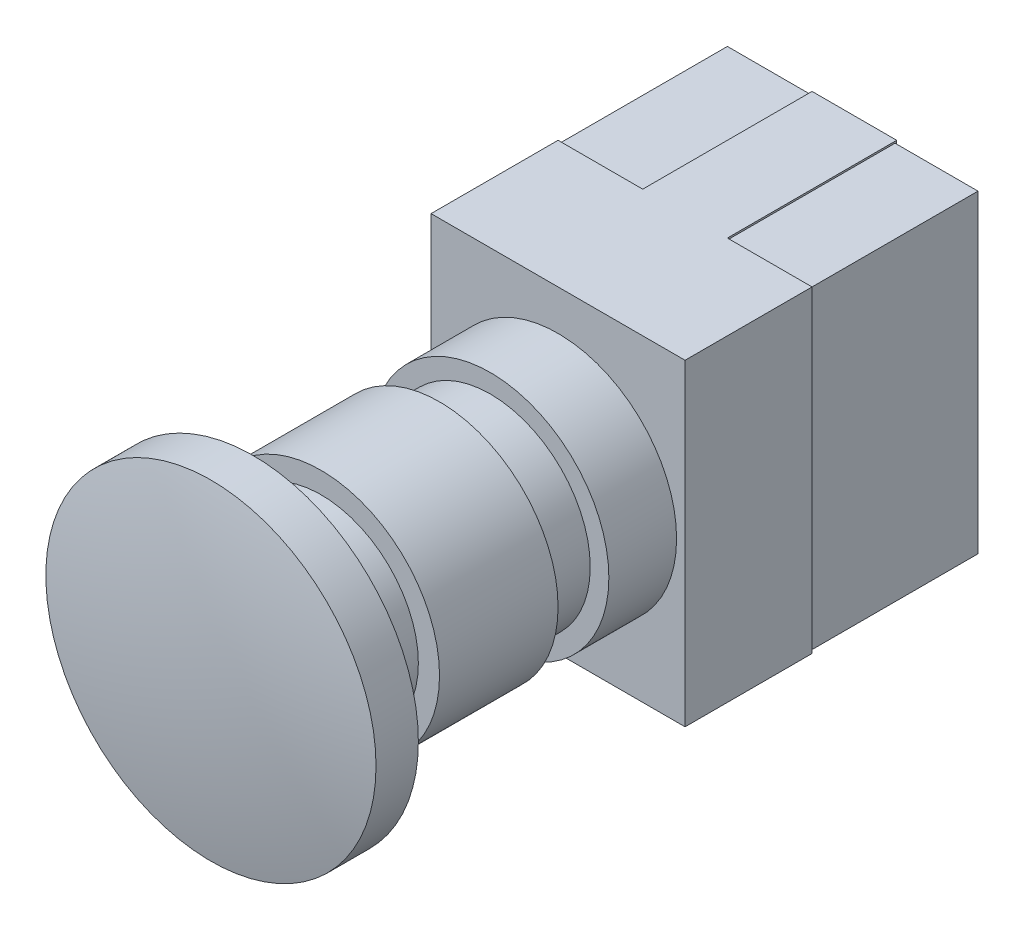
ISO-10303-21;
HEADER;
FILE_DESCRIPTION(('STEP AP214'),'2;1');
FILE_NAME('part.step','',(''),(''),'','','');
FILE_SCHEMA(('AUTOMOTIVE_DESIGN { 1 0 10303 214 1 1 1 1 }'));
ENDSEC;
DATA;
#1=APPLICATION_CONTEXT('core data for automotive mechanical design processes');
#2=APPLICATION_PROTOCOL_DEFINITION('international standard','automotive_design',2000,#1);
#3=PRODUCT_CONTEXT('',#1,'mechanical');
#4=PRODUCT('Part','Part','',(#3));
#5=PRODUCT_RELATED_PRODUCT_CATEGORY('part','',(#4));
#6=PRODUCT_DEFINITION_FORMATION('','',#4);
#7=PRODUCT_DEFINITION_CONTEXT('part definition',#1,'design');
#8=PRODUCT_DEFINITION('design','',#6,#7);
#9=PRODUCT_DEFINITION_SHAPE('','',#8);
#10=(LENGTH_UNIT() NAMED_UNIT(*) SI_UNIT(.MILLI.,.METRE.));
#11=(NAMED_UNIT(*) PLANE_ANGLE_UNIT() SI_UNIT($,.RADIAN.));
#12=(NAMED_UNIT(*) SI_UNIT($,.STERADIAN.) SOLID_ANGLE_UNIT());
#13=UNCERTAINTY_MEASURE_WITH_UNIT(LENGTH_MEASURE(1.E-05),#10,'distance_accuracy_value','');
#14=(GEOMETRIC_REPRESENTATION_CONTEXT(3) GLOBAL_UNCERTAINTY_ASSIGNED_CONTEXT((#13)) GLOBAL_UNIT_ASSIGNED_CONTEXT((#10,
#11,#12)) REPRESENTATION_CONTEXT('',''));
#15=CARTESIAN_POINT('',(0.,0.,0.));
#16=DIRECTION('',(0.,0.,1.));
#17=DIRECTION('',(1.,0.,0.));
#18=AXIS2_PLACEMENT_3D('',#15,#16,#17);
#19=CARTESIAN_POINT('',(5.,18.55,20.));
#20=DIRECTION('',(0.,-1.,0.));
#21=DIRECTION('',(0.,0.,-1.));
#22=AXIS2_PLACEMENT_3D('',#19,#20,#21);
#23=PLANE('',#22);
#24=DIRECTION('',(1.,0.,0.));
#25=VECTOR('',#24,1.);
#26=CARTESIAN_POINT('',(14.8,18.55,0.2));
#27=LINE('',#26,#25);
#28=CARTESIAN_POINT('',(5.,18.55,0.2));
#29=VERTEX_POINT('',#28);
#30=CARTESIAN_POINT('',(14.8,18.55,0.2));
#31=VERTEX_POINT('',#30);
#32=EDGE_CURVE('E163',#29,#31,#27,.T.);
#33=ORIENTED_EDGE('',*,*,#32,.F.);
#34=DIRECTION('',(0.,0.,-1.));
#35=VECTOR('',#34,1.);
#36=CARTESIAN_POINT('',(5.,18.55,20.));
#37=LINE('',#36,#35);
#38=CARTESIAN_POINT('',(5.,18.55,20.));
#39=VERTEX_POINT('',#38);
#40=EDGE_CURVE('E193',#39,#29,#37,.T.);
#41=ORIENTED_EDGE('',*,*,#40,.F.);
#42=DIRECTION('',(-1.,0.,0.));
#43=VECTOR('',#42,1.);
#44=CARTESIAN_POINT('',(5.,18.55,20.));
#45=LINE('',#44,#43);
#46=CARTESIAN_POINT('',(14.8,18.55,20.));
#47=VERTEX_POINT('',#46);
#48=EDGE_CURVE('E325',#47,#39,#45,.T.);
#49=ORIENTED_EDGE('',*,*,#48,.F.);
#50=DIRECTION('',(0.,0.,-1.));
#51=VECTOR('',#50,1.);
#52=CARTESIAN_POINT('',(14.8,18.55,20.));
#53=LINE('',#52,#51);
#54=EDGE_CURVE('E180',#47,#31,#53,.T.);
#55=ORIENTED_EDGE('',*,*,#54,.T.);
#56=EDGE_LOOP('',(#33,#41,#49,#55));
#57=FACE_BOUND('',#56,.T.);
#58=ADVANCED_FACE('F41',(#57),#23,.F.);
#59=CARTESIAN_POINT('',(14.8,-18.55,20.));
#60=DIRECTION('',(-1.,0.,0.));
#61=DIRECTION('',(0.,0.,1.));
#62=AXIS2_PLACEMENT_3D('',#59,#60,#61);
#63=PLANE('',#62);
#64=DIRECTION('',(0.,-1.,0.));
#65=VECTOR('',#64,1.);
#66=CARTESIAN_POINT('',(14.8,18.55,0.2));
#67=LINE('',#66,#65);
#68=CARTESIAN_POINT('',(14.8,-18.55,0.2));
#69=VERTEX_POINT('',#68);
#70=EDGE_CURVE('E157',#31,#69,#67,.T.);
#71=ORIENTED_EDGE('',*,*,#70,.F.);
#72=ORIENTED_EDGE('',*,*,#54,.F.);
#73=DIRECTION('',(0.,1.,0.));
#74=VECTOR('',#73,1.);
#75=CARTESIAN_POINT('',(14.8,-18.55,20.));
#76=LINE('',#75,#74);
#77=CARTESIAN_POINT('',(14.8,-18.55,20.));
#78=VERTEX_POINT('',#77);
#79=EDGE_CURVE('E179',#78,#47,#76,.T.);
#80=ORIENTED_EDGE('',*,*,#79,.F.);
#81=DIRECTION('',(0.,0.,-1.));
#82=VECTOR('',#81,1.);
#83=CARTESIAN_POINT('',(14.8,-18.55,20.));
#84=LINE('',#83,#82);
#85=EDGE_CURVE('E171',#78,#69,#84,.T.);
#86=ORIENTED_EDGE('',*,*,#85,.T.);
#87=EDGE_LOOP('',(#71,#72,#80,#86));
#88=FACE_BOUND('',#87,.T.);
#89=ADVANCED_FACE('F177',(#88),#63,.F.);
#90=CARTESIAN_POINT('',(5.,-18.55,20.));
#91=DIRECTION('',(0.,1.,0.));
#92=DIRECTION('',(0.,0.,1.));
#93=AXIS2_PLACEMENT_3D('',#90,#91,#92);
#94=PLANE('',#93);
#95=DIRECTION('',(-1.,0.,0.));
#96=VECTOR('',#95,1.);
#97=CARTESIAN_POINT('',(14.8,-18.55,0.2));
#98=LINE('',#97,#96);
#99=CARTESIAN_POINT('',(5.,-18.55,0.2));
#100=VERTEX_POINT('',#99);
#101=EDGE_CURVE('E160',#69,#100,#98,.T.);
#102=ORIENTED_EDGE('',*,*,#101,.F.);
#103=ORIENTED_EDGE('',*,*,#85,.F.);
#104=DIRECTION('',(1.,0.,0.));
#105=VECTOR('',#104,1.);
#106=CARTESIAN_POINT('',(5.,-18.55,20.));
#107=LINE('',#106,#105);
#108=CARTESIAN_POINT('',(5.,-18.55,20.));
#109=VERTEX_POINT('',#108);
#110=EDGE_CURVE('E323',#109,#78,#107,.T.);
#111=ORIENTED_EDGE('',*,*,#110,.F.);
#112=DIRECTION('',(0.,0.,-1.));
#113=VECTOR('',#112,1.);
#114=CARTESIAN_POINT('',(5.,-18.55,20.));
#115=LINE('',#114,#113);
#116=EDGE_CURVE('E173',#109,#100,#115,.T.);
#117=ORIENTED_EDGE('',*,*,#116,.T.);
#118=EDGE_LOOP('',(#102,#103,#111,#117));
#119=FACE_BOUND('',#118,.T.);
#120=ADVANCED_FACE('F169',(#119),#94,.F.);
#121=CARTESIAN_POINT('',(-15.,18.75,35.));
#122=DIRECTION('',(1.,0.,0.));
#123=DIRECTION('',(0.,1.,0.));
#124=AXIS2_PLACEMENT_3D('',#121,#122,#123);
#125=PLANE('',#124);
#126=DIRECTION('',(0.,1.,0.));
#127=VECTOR('',#126,1.);
#128=CARTESIAN_POINT('',(-15.,-18.75,20.));
#129=LINE('',#128,#127);
#130=CARTESIAN_POINT('',(-15.,-18.75,20.));
#131=VERTEX_POINT('',#130);
#132=CARTESIAN_POINT('',(-15.,18.75,20.));
#133=VERTEX_POINT('',#132);
#134=EDGE_CURVE('E227',#131,#133,#129,.T.);
#135=ORIENTED_EDGE('',*,*,#134,.F.);
#136=DIRECTION('',(0.,0.,-1.));
#137=VECTOR('',#136,1.);
#138=CARTESIAN_POINT('',(-15.,-18.75,35.));
#139=LINE('',#138,#137);
#140=CARTESIAN_POINT('',(-15.,-18.75,35.));
#141=VERTEX_POINT('',#140);
#142=EDGE_CURVE('E292',#141,#131,#139,.T.);
#143=ORIENTED_EDGE('',*,*,#142,.F.);
#144=DIRECTION('',(0.,-1.,0.));
#145=VECTOR('',#144,1.);
#146=CARTESIAN_POINT('',(-15.,18.75,35.));
#147=LINE('',#146,#145);
#148=CARTESIAN_POINT('',(-15.,18.75,35.));
#149=VERTEX_POINT('',#148);
#150=EDGE_CURVE('E282',#149,#141,#147,.T.);
#151=ORIENTED_EDGE('',*,*,#150,.F.);
#152=DIRECTION('',(0.,0.,-1.));
#153=VECTOR('',#152,1.);
#154=CARTESIAN_POINT('',(-15.,18.75,35.));
#155=LINE('',#154,#153);
#156=EDGE_CURVE('E294',#149,#133,#155,.T.);
#157=ORIENTED_EDGE('',*,*,#156,.T.);
#158=EDGE_LOOP('',(#135,#143,#151,#157));
#159=FACE_BOUND('',#158,.T.);
#160=ADVANCED_FACE('F450',(#159),#125,.F.);
#161=CARTESIAN_POINT('',(15.,18.75,35.));
#162=DIRECTION('',(-1.,0.,0.));
#163=DIRECTION('',(0.,-1.,0.));
#164=AXIS2_PLACEMENT_3D('',#161,#162,#163);
#165=PLANE('',#164);
#166=DIRECTION('',(0.,0.,-1.));
#167=VECTOR('',#166,1.);
#168=CARTESIAN_POINT('',(15.,-18.75,35.));
#169=LINE('',#168,#167);
#170=CARTESIAN_POINT('',(15.,-18.75,35.));
#171=VERTEX_POINT('',#170);
#172=CARTESIAN_POINT('',(15.,-18.75,20.));
#173=VERTEX_POINT('',#172);
#174=EDGE_CURVE('E285',#171,#173,#169,.T.);
#175=ORIENTED_EDGE('',*,*,#174,.T.);
#176=DIRECTION('',(0.,-1.,0.));
#177=VECTOR('',#176,1.);
#178=CARTESIAN_POINT('',(15.,-18.75,20.));
#179=LINE('',#178,#177);
#180=CARTESIAN_POINT('',(15.,18.75,20.));
#181=VERTEX_POINT('',#180);
#182=EDGE_CURVE('E309',#181,#173,#179,.T.);
#183=ORIENTED_EDGE('',*,*,#182,.F.);
#184=DIRECTION('',(0.,0.,-1.));
#185=VECTOR('',#184,1.);
#186=CARTESIAN_POINT('',(15.,18.75,35.));
#187=LINE('',#186,#185);
#188=CARTESIAN_POINT('',(15.,18.75,35.));
#189=VERTEX_POINT('',#188);
#190=EDGE_CURVE('E45',#189,#181,#187,.T.);
#191=ORIENTED_EDGE('',*,*,#190,.F.);
#192=DIRECTION('',(0.,1.,0.));
#193=VECTOR('',#192,1.);
#194=CARTESIAN_POINT('',(15.,18.75,35.));
#195=LINE('',#194,#193);
#196=EDGE_CURVE('E277',#171,#189,#195,.T.);
#197=ORIENTED_EDGE('',*,*,#196,.F.);
#198=EDGE_LOOP('',(#175,#183,#191,#197));
#199=FACE_BOUND('',#198,.T.);
#200=ADVANCED_FACE('F43',(#199),#165,.F.);
#201=CARTESIAN_POINT('',(-15.,18.75,35.));
#202=DIRECTION('',(0.,-1.,0.));
#203=DIRECTION('',(1.,0.,0.));
#204=AXIS2_PLACEMENT_3D('',#201,#202,#203);
#205=PLANE('',#204);
#206=DIRECTION('',(1.,0.,0.));
#207=VECTOR('',#206,1.);
#208=CARTESIAN_POINT('',(5.,18.75,20.));
#209=LINE('',#208,#207);
#210=CARTESIAN_POINT('',(5.,18.75,20.));
#211=VERTEX_POINT('',#210);
#212=EDGE_CURVE('E305',#211,#181,#209,.T.);
#213=ORIENTED_EDGE('',*,*,#212,.F.);
#214=DIRECTION('',(0.,0.,-1.));
#215=VECTOR('',#214,1.);
#216=CARTESIAN_POINT('',(5.,18.75,20.));
#217=LINE('',#216,#215);
#218=CARTESIAN_POINT('',(5.,18.75,0.));
#219=VERTEX_POINT('',#218);
#220=EDGE_CURVE('E190',#211,#219,#217,.T.);
#221=ORIENTED_EDGE('',*,*,#220,.T.);
#222=DIRECTION('',(-1.,0.,0.));
#223=VECTOR('',#222,1.);
#224=CARTESIAN_POINT('',(-15.,18.75,0.));
#225=LINE('',#224,#223);
#226=CARTESIAN_POINT('',(-5.,18.75,0.));
#227=VERTEX_POINT('',#226);
#228=EDGE_CURVE('E274',#219,#227,#225,.T.);
#229=ORIENTED_EDGE('',*,*,#228,.T.);
#230=DIRECTION('',(0.,0.,-1.));
#231=VECTOR('',#230,1.);
#232=CARTESIAN_POINT('',(-5.,18.75,20.));
#233=LINE('',#232,#231);
#234=CARTESIAN_POINT('',(-5.,18.75,20.));
#235=VERTEX_POINT('',#234);
#236=EDGE_CURVE('E206',#235,#227,#233,.T.);
#237=ORIENTED_EDGE('',*,*,#236,.F.);
#238=DIRECTION('',(1.,0.,0.));
#239=VECTOR('',#238,1.);
#240=CARTESIAN_POINT('',(-15.,18.75,20.));
#241=LINE('',#240,#239);
#242=EDGE_CURVE('E224',#133,#235,#241,.T.);
#243=ORIENTED_EDGE('',*,*,#242,.F.);
#244=ORIENTED_EDGE('',*,*,#156,.F.);
#245=DIRECTION('',(-1.,0.,0.));
#246=VECTOR('',#245,1.);
#247=CARTESIAN_POINT('',(-15.,18.75,35.));
#248=LINE('',#247,#246);
#249=EDGE_CURVE('E279',#189,#149,#248,.T.);
#250=ORIENTED_EDGE('',*,*,#249,.F.);
#251=ORIENTED_EDGE('',*,*,#190,.T.);
#252=EDGE_LOOP('',(#213,#221,#229,#237,#243,#244,#250,#251));
#253=FACE_BOUND('',#252,.T.);
#254=ADVANCED_FACE('F304',(#253),#205,.F.);
#255=CARTESIAN_POINT('',(-15.,-18.75,35.));
#256=DIRECTION('',(0.,1.,0.));
#257=DIRECTION('',(-1.,0.,0.));
#258=AXIS2_PLACEMENT_3D('',#255,#256,#257);
#259=PLANE('',#258);
#260=DIRECTION('',(1.,0.,0.));
#261=VECTOR('',#260,1.);
#262=CARTESIAN_POINT('',(-15.,-18.75,0.));
#263=LINE('',#262,#261);
#264=CARTESIAN_POINT('',(-5.,-18.75,0.));
#265=VERTEX_POINT('',#264);
#266=CARTESIAN_POINT('',(5.,-18.75,0.));
#267=VERTEX_POINT('',#266);
#268=EDGE_CURVE('E280',#265,#267,#263,.T.);
#269=ORIENTED_EDGE('',*,*,#268,.T.);
#270=DIRECTION('',(0.,0.,-1.));
#271=VECTOR('',#270,1.);
#272=CARTESIAN_POINT('',(5.,-18.75,20.));
#273=LINE('',#272,#271);
#274=CARTESIAN_POINT('',(5.,-18.75,20.));
#275=VERTEX_POINT('',#274);
#276=EDGE_CURVE('E184',#275,#267,#273,.T.);
#277=ORIENTED_EDGE('',*,*,#276,.F.);
#278=DIRECTION('',(-1.,0.,0.));
#279=VECTOR('',#278,1.);
#280=CARTESIAN_POINT('',(5.,-18.75,20.));
#281=LINE('',#280,#279);
#282=EDGE_CURVE('E313',#173,#275,#281,.T.);
#283=ORIENTED_EDGE('',*,*,#282,.F.);
#284=ORIENTED_EDGE('',*,*,#174,.F.);
#285=DIRECTION('',(1.,0.,0.));
#286=VECTOR('',#285,1.);
#287=CARTESIAN_POINT('',(-15.,-18.75,35.));
#288=LINE('',#287,#286);
#289=EDGE_CURVE('E66',#141,#171,#288,.T.);
#290=ORIENTED_EDGE('',*,*,#289,.F.);
#291=ORIENTED_EDGE('',*,*,#142,.T.);
#292=DIRECTION('',(-1.,0.,0.));
#293=VECTOR('',#292,1.);
#294=CARTESIAN_POINT('',(-15.,-18.75,20.));
#295=LINE('',#294,#293);
#296=CARTESIAN_POINT('',(-5.,-18.75,20.));
#297=VERTEX_POINT('',#296);
#298=EDGE_CURVE('E229',#297,#131,#295,.T.);
#299=ORIENTED_EDGE('',*,*,#298,.F.);
#300=DIRECTION('',(0.,0.,-1.));
#301=VECTOR('',#300,1.);
#302=CARTESIAN_POINT('',(-5.,-18.75,20.));
#303=LINE('',#302,#301);
#304=EDGE_CURVE('E203',#297,#265,#303,.T.);
#305=ORIENTED_EDGE('',*,*,#304,.T.);
#306=EDGE_LOOP('',(#269,#277,#283,#284,#290,#291,#299,#305));
#307=FACE_BOUND('',#306,.T.);
#308=ADVANCED_FACE('F442',(#307),#259,.F.);
#309=CARTESIAN_POINT('',(0.,0.,35.));
#310=DIRECTION('',(0.,0.,1.));
#311=DIRECTION('',(1.,0.,0.));
#312=AXIS2_PLACEMENT_3D('',#309,#310,#311);
#313=PLANE('',#312);
#314=CARTESIAN_POINT('',(0.,0.,35.));
#315=DIRECTION('',(0.,0.,1.));
#316=DIRECTION('',(1.,0.,0.));
#317=AXIS2_PLACEMENT_3D('',#314,#315,#316);
#318=CIRCLE('',#317,14.);
#319=CARTESIAN_POINT('',(14.,0.,35.));
#320=VERTEX_POINT('',#319);
#321=EDGE_CURVE('E271',#320,#320,#318,.T.);
#322=ORIENTED_EDGE('',*,*,#321,.F.);
#323=EDGE_LOOP('',(#322));
#324=FACE_BOUND('',#323,.T.);
#325=ORIENTED_EDGE('',*,*,#196,.T.);
#326=ORIENTED_EDGE('',*,*,#249,.T.);
#327=ORIENTED_EDGE('',*,*,#150,.T.);
#328=ORIENTED_EDGE('',*,*,#289,.T.);
#329=EDGE_LOOP('',(#325,#326,#327,#328));
#330=FACE_BOUND('',#329,.T.);
#331=ADVANCED_FACE('F439',(#324,#330),#313,.T.);
#332=CARTESIAN_POINT('',(0.,0.,0.));
#333=DIRECTION('',(0.,0.,1.));
#334=DIRECTION('',(1.,0.,0.));
#335=AXIS2_PLACEMENT_3D('',#332,#333,#334);
#336=PLANE('',#335);
#337=DIRECTION('',(0.,1.,0.));
#338=VECTOR('',#337,1.);
#339=CARTESIAN_POINT('',(5.,18.75,0.));
#340=LINE('',#339,#338);
#341=EDGE_CURVE('E217',#267,#219,#340,.T.);
#342=ORIENTED_EDGE('',*,*,#341,.F.);
#343=ORIENTED_EDGE('',*,*,#268,.F.);
#344=DIRECTION('',(0.,-1.,0.));
#345=VECTOR('',#344,1.);
#346=CARTESIAN_POINT('',(-5.,-18.75,0.));
#347=LINE('',#346,#345);
#348=EDGE_CURVE('E215',#227,#265,#347,.T.);
#349=ORIENTED_EDGE('',*,*,#348,.F.);
#350=ORIENTED_EDGE('',*,*,#228,.F.);
#351=EDGE_LOOP('',(#342,#343,#349,#350));
#352=FACE_BOUND('',#351,.T.);
#353=ADVANCED_FACE('F437',(#352),#336,.F.);
#354=CARTESIAN_POINT('',(0.,0.,43.));
#355=DIRECTION('',(0.,0.,-1.));
#356=DIRECTION('',(-1.,0.,0.));
#357=AXIS2_PLACEMENT_3D('',#354,#355,#356);
#358=CYLINDRICAL_SURFACE('',#357,14.);
#359=CARTESIAN_POINT('',(0.,0.,43.));
#360=DIRECTION('',(0.,0.,1.));
#361=DIRECTION('',(1.,0.,0.));
#362=AXIS2_PLACEMENT_3D('',#359,#360,#361);
#363=CIRCLE('',#362,14.);
#364=CARTESIAN_POINT('',(14.,0.,43.));
#365=VERTEX_POINT('',#364);
#366=EDGE_CURVE('E268',#365,#365,#363,.T.);
#367=ORIENTED_EDGE('',*,*,#366,.F.);
#368=EDGE_LOOP('',(#367));
#369=FACE_BOUND('',#368,.T.);
#370=ORIENTED_EDGE('',*,*,#321,.T.);
#371=EDGE_LOOP('',(#370));
#372=FACE_BOUND('',#371,.T.);
#373=ADVANCED_FACE('F433',(#369,#372),#358,.T.);
#374=CARTESIAN_POINT('',(0.,0.,43.));
#375=DIRECTION('',(0.,0.,1.));
#376=DIRECTION('',(1.,0.,0.));
#377=AXIS2_PLACEMENT_3D('',#374,#375,#376);
#378=PLANE('',#377);
#379=CARTESIAN_POINT('',(0.,0.,43.));
#380=DIRECTION('',(0.,0.,1.));
#381=DIRECTION('',(1.,0.,0.));
#382=AXIS2_PLACEMENT_3D('',#379,#380,#381);
#383=CIRCLE('',#382,11.8);
#384=CARTESIAN_POINT('',(11.8,0.,43.));
#385=VERTEX_POINT('',#384);
#386=EDGE_CURVE('E50',#385,#385,#383,.T.);
#387=ORIENTED_EDGE('',*,*,#386,.F.);
#388=EDGE_LOOP('',(#387));
#389=FACE_BOUND('',#388,.T.);
#390=ORIENTED_EDGE('',*,*,#366,.T.);
#391=EDGE_LOOP('',(#390));
#392=FACE_BOUND('',#391,.T.);
#393=ADVANCED_FACE('F429',(#389,#392),#378,.T.);
#394=CARTESIAN_POINT('',(0.,0.,49.));
#395=DIRECTION('',(0.,0.,-1.));
#396=DIRECTION('',(-1.,0.,0.));
#397=AXIS2_PLACEMENT_3D('',#394,#395,#396);
#398=CYLINDRICAL_SURFACE('',#397,11.8);
#399=CARTESIAN_POINT('',(0.,0.,49.));
#400=DIRECTION('',(0.,0.,1.));
#401=DIRECTION('',(1.,0.,0.));
#402=AXIS2_PLACEMENT_3D('',#399,#400,#401);
#403=CIRCLE('',#402,11.8);
#404=CARTESIAN_POINT('',(11.8,0.,49.));
#405=VERTEX_POINT('',#404);
#406=EDGE_CURVE('E263',#405,#405,#403,.T.);
#407=ORIENTED_EDGE('',*,*,#406,.F.);
#408=EDGE_LOOP('',(#407));
#409=FACE_BOUND('',#408,.T.);
#410=ORIENTED_EDGE('',*,*,#386,.T.);
#411=EDGE_LOOP('',(#410));
#412=FACE_BOUND('',#411,.T.);
#413=ADVANCED_FACE('F425',(#409,#412),#398,.T.);
#414=CARTESIAN_POINT('',(0.,0.,63.));
#415=DIRECTION('',(0.,0.,-1.));
#416=DIRECTION('',(-1.,0.,0.));
#417=AXIS2_PLACEMENT_3D('',#414,#415,#416);
#418=CYLINDRICAL_SURFACE('',#417,14.);
#419=CARTESIAN_POINT('',(0.,0.,63.));
#420=DIRECTION('',(0.,0.,1.));
#421=DIRECTION('',(1.,0.,0.));
#422=AXIS2_PLACEMENT_3D('',#419,#420,#421);
#423=CIRCLE('',#422,14.);
#424=CARTESIAN_POINT('',(14.,0.,63.));
#425=VERTEX_POINT('',#424);
#426=EDGE_CURVE('E260',#425,#425,#423,.T.);
#427=ORIENTED_EDGE('',*,*,#426,.F.);
#428=EDGE_LOOP('',(#427));
#429=FACE_BOUND('',#428,.T.);
#430=CARTESIAN_POINT('',(0.,0.,49.));
#431=DIRECTION('',(0.,0.,1.));
#432=DIRECTION('',(1.,0.,0.));
#433=AXIS2_PLACEMENT_3D('',#430,#431,#432);
#434=CIRCLE('',#433,14.);
#435=CARTESIAN_POINT('',(14.,0.,49.));
#436=VERTEX_POINT('',#435);
#437=EDGE_CURVE('E258',#436,#436,#434,.T.);
#438=ORIENTED_EDGE('',*,*,#437,.T.);
#439=EDGE_LOOP('',(#438));
#440=FACE_BOUND('',#439,.T.);
#441=ADVANCED_FACE('F418',(#429,#440),#418,.T.);
#442=CARTESIAN_POINT('',(0.,0.,63.));
#443=DIRECTION('',(0.,0.,1.));
#444=DIRECTION('',(1.,0.,0.));
#445=AXIS2_PLACEMENT_3D('',#442,#443,#444);
#446=PLANE('',#445);
#447=CARTESIAN_POINT('',(0.,0.,63.));
#448=DIRECTION('',(0.,0.,1.));
#449=DIRECTION('',(1.,0.,0.));
#450=AXIS2_PLACEMENT_3D('',#447,#448,#449);
#451=CIRCLE('',#450,11.5);
#452=CARTESIAN_POINT('',(11.5,0.,63.));
#453=VERTEX_POINT('',#452);
#454=EDGE_CURVE('E11',#453,#453,#451,.T.);
#455=ORIENTED_EDGE('',*,*,#454,.F.);
#456=EDGE_LOOP('',(#455));
#457=FACE_BOUND('',#456,.T.);
#458=ORIENTED_EDGE('',*,*,#426,.T.);
#459=EDGE_LOOP('',(#458));
#460=FACE_BOUND('',#459,.T.);
#461=ADVANCED_FACE('F415',(#457,#460),#446,.T.);
#462=CARTESIAN_POINT('',(0.,0.,49.));
#463=DIRECTION('',(0.,0.,1.));
#464=DIRECTION('',(1.,0.,0.));
#465=AXIS2_PLACEMENT_3D('',#462,#463,#464);
#466=PLANE('',#465);
#467=ORIENTED_EDGE('',*,*,#406,.T.);
#468=EDGE_LOOP('',(#467));
#469=FACE_BOUND('',#468,.T.);
#470=ORIENTED_EDGE('',*,*,#437,.F.);
#471=EDGE_LOOP('',(#470));
#472=FACE_BOUND('',#471,.T.);
#473=ADVANCED_FACE('F413',(#469,#472),#466,.F.);
#474=CARTESIAN_POINT('',(0.,0.,71.));
#475=DIRECTION('',(0.,0.,-1.));
#476=DIRECTION('',(-1.,0.,0.));
#477=AXIS2_PLACEMENT_3D('',#474,#475,#476);
#478=CYLINDRICAL_SURFACE('',#477,11.5);
#479=CARTESIAN_POINT('',(0.,0.,71.));
#480=DIRECTION('',(0.,0.,1.));
#481=DIRECTION('',(1.,0.,0.));
#482=AXIS2_PLACEMENT_3D('',#479,#480,#481);
#483=CIRCLE('',#482,11.5);
#484=CARTESIAN_POINT('',(11.5,0.,71.));
#485=VERTEX_POINT('',#484);
#486=EDGE_CURVE('E256',#485,#485,#483,.T.);
#487=ORIENTED_EDGE('',*,*,#486,.F.);
#488=EDGE_LOOP('',(#487));
#489=FACE_BOUND('',#488,.T.);
#490=ORIENTED_EDGE('',*,*,#454,.T.);
#491=EDGE_LOOP('',(#490));
#492=FACE_BOUND('',#491,.T.);
#493=ADVANCED_FACE('F409',(#489,#492),#478,.T.);
#494=CARTESIAN_POINT('',(0.,0.,71.));
#495=DIRECTION('',(0.,0.,-1.));
#496=DIRECTION('',(-1.,0.,0.));
#497=AXIS2_PLACEMENT_3D('',#494,#495,#496);
#498=PLANE('',#497);
#499=ORIENTED_EDGE('',*,*,#486,.T.);
#500=EDGE_LOOP('',(#499));
#501=FACE_BOUND('',#500,.T.);
#502=CARTESIAN_POINT('',(0.,0.,71.));
#503=DIRECTION('',(0.,0.,1.));
#504=DIRECTION('',(1.,0.,0.));
#505=AXIS2_PLACEMENT_3D('',#502,#503,#504);
#506=CIRCLE('',#505,12.5);
#507=CARTESIAN_POINT('',(12.5,0.,71.));
#508=VERTEX_POINT('',#507);
#509=EDGE_CURVE('E253',#508,#508,#506,.T.);
#510=ORIENTED_EDGE('',*,*,#509,.F.);
#511=EDGE_LOOP('',(#510));
#512=FACE_BOUND('',#511,.T.);
#513=ADVANCED_FACE('F405',(#501,#512),#498,.T.);
#514=CARTESIAN_POINT('',(0.,0.,71.));
#515=DIRECTION('',(0.,0.,1.));
#516=DIRECTION('',(1.,0.,0.));
#517=AXIS2_PLACEMENT_3D('',#514,#515,#516);
#518=CYLINDRICAL_SURFACE('',#517,12.5);
#519=ORIENTED_EDGE('',*,*,#509,.T.);
#520=EDGE_LOOP('',(#519));
#521=FACE_BOUND('',#520,.T.);
#522=CARTESIAN_POINT('',(0.,0.,72.));
#523=DIRECTION('',(0.,0.,1.));
#524=DIRECTION('',(1.,0.,0.));
#525=AXIS2_PLACEMENT_3D('',#522,#523,#524);
#526=CIRCLE('',#525,12.5);
#527=CARTESIAN_POINT('',(12.5,0.,72.));
#528=VERTEX_POINT('',#527);
#529=EDGE_CURVE('E250',#528,#528,#526,.T.);
#530=ORIENTED_EDGE('',*,*,#529,.F.);
#531=EDGE_LOOP('',(#530));
#532=FACE_BOUND('',#531,.T.);
#533=ADVANCED_FACE('F401',(#521,#532),#518,.T.);
#534=CARTESIAN_POINT('',(18.5,0.,72.));
#535=DIRECTION('',(0.,0.,-1.));
#536=DIRECTION('',(-1.,0.,0.));
#537=AXIS2_PLACEMENT_3D('',#534,#535,#536);
#538=PLANE('',#537);
#539=ORIENTED_EDGE('',*,*,#529,.T.);
#540=EDGE_LOOP('',(#539));
#541=FACE_BOUND('',#540,.T.);
#542=CARTESIAN_POINT('',(0.,0.,72.));
#543=DIRECTION('',(0.,0.,1.));
#544=DIRECTION('',(1.,0.,0.));
#545=AXIS2_PLACEMENT_3D('',#542,#543,#544);
#546=CIRCLE('',#545,18.5);
#547=CARTESIAN_POINT('',(18.5,0.,72.));
#548=VERTEX_POINT('',#547);
#549=EDGE_CURVE('E247',#548,#548,#546,.T.);
#550=ORIENTED_EDGE('',*,*,#549,.F.);
#551=EDGE_LOOP('',(#550));
#552=FACE_BOUND('',#551,.T.);
#553=ADVANCED_FACE('F397',(#541,#552),#538,.T.);
#554=CARTESIAN_POINT('',(0.,0.,71.));
#555=DIRECTION('',(0.,0.,1.));
#556=DIRECTION('',(1.,0.,0.));
#557=AXIS2_PLACEMENT_3D('',#554,#555,#556);
#558=CYLINDRICAL_SURFACE('',#557,18.5);
#559=ORIENTED_EDGE('',*,*,#549,.T.);
#560=EDGE_LOOP('',(#559));
#561=FACE_BOUND('',#560,.T.);
#562=CARTESIAN_POINT('',(0.,0.,71.));
#563=DIRECTION('',(0.,0.,1.));
#564=DIRECTION('',(1.,0.,0.));
#565=AXIS2_PLACEMENT_3D('',#562,#563,#564);
#566=CIRCLE('',#565,18.5);
#567=CARTESIAN_POINT('',(18.5,0.,71.));
#568=VERTEX_POINT('',#567);
#569=EDGE_CURVE('E244',#568,#568,#566,.T.);
#570=ORIENTED_EDGE('',*,*,#569,.F.);
#571=EDGE_LOOP('',(#570));
#572=FACE_BOUND('',#571,.T.);
#573=ADVANCED_FACE('F393',(#561,#572),#558,.F.);
#574=CARTESIAN_POINT('',(18.5,0.,71.));
#575=DIRECTION('',(0.,0.,-1.));
#576=DIRECTION('',(-1.,0.,0.));
#577=AXIS2_PLACEMENT_3D('',#574,#575,#576);
#578=PLANE('',#577);
#579=ORIENTED_EDGE('',*,*,#569,.T.);
#580=EDGE_LOOP('',(#579));
#581=FACE_BOUND('',#580,.T.);
#582=CARTESIAN_POINT('',(0.,0.,71.));
#583=DIRECTION('',(0.,0.,1.));
#584=DIRECTION('',(1.,0.,0.));
#585=AXIS2_PLACEMENT_3D('',#582,#583,#584);
#586=CIRCLE('',#585,19.5);
#587=CARTESIAN_POINT('',(19.5,0.,71.));
#588=VERTEX_POINT('',#587);
#589=EDGE_CURVE('E241',#588,#588,#586,.T.);
#590=ORIENTED_EDGE('',*,*,#589,.F.);
#591=EDGE_LOOP('',(#590));
#592=FACE_BOUND('',#591,.T.);
#593=ADVANCED_FACE('F389',(#581,#592),#578,.T.);
#594=CARTESIAN_POINT('',(0.,0.,71.));
#595=DIRECTION('',(0.,0.,1.));
#596=DIRECTION('',(1.,0.,0.));
#597=AXIS2_PLACEMENT_3D('',#594,#595,#596);
#598=CYLINDRICAL_SURFACE('',#597,19.5);
#599=ORIENTED_EDGE('',*,*,#589,.T.);
#600=EDGE_LOOP('',(#599));
#601=FACE_BOUND('',#600,.T.);
#602=CARTESIAN_POINT('',(0.,0.,76.));
#603=DIRECTION('',(0.,0.,1.));
#604=DIRECTION('',(1.,0.,0.));
#605=AXIS2_PLACEMENT_3D('',#602,#603,#604);
#606=CIRCLE('',#605,19.5);
#607=CARTESIAN_POINT('',(19.5,0.,76.));
#608=VERTEX_POINT('',#607);
#609=EDGE_CURVE('E182',#608,#608,#606,.T.);
#610=ORIENTED_EDGE('',*,*,#609,.F.);
#611=EDGE_LOOP('',(#610));
#612=FACE_BOUND('',#611,.T.);
#613=ADVANCED_FACE('F385',(#601,#612),#598,.T.);
#614=CARTESIAN_POINT('',(0.,0.,-18.0624999999999));
#615=DIRECTION('',(0.,0.,1.));
#616=DIRECTION('',(1.,0.,0.));
#617=AXIS2_PLACEMENT_3D('',#614,#615,#616);
#618=SPHERICAL_SURFACE('',#617,96.0624999999999);
#619=ORIENTED_EDGE('',*,*,#609,.T.);
#620=EDGE_LOOP('',(#619));
#621=FACE_BOUND('',#620,.T.);
#622=ADVANCED_FACE('F367',(#621),#618,.T.);
#623=CARTESIAN_POINT('',(-14.8,-18.55,20.));
#624=DIRECTION('',(1.,0.,0.));
#625=DIRECTION('',(0.,0.,-1.));
#626=AXIS2_PLACEMENT_3D('',#623,#624,#625);
#627=PLANE('',#626);
#628=DIRECTION('',(0.,0.,-1.));
#629=VECTOR('',#628,1.);
#630=CARTESIAN_POINT('',(-14.8,18.55,20.));
#631=LINE('',#630,#629);
#632=CARTESIAN_POINT('',(-14.8,18.55,20.));
#633=VERTEX_POINT('',#632);
#634=CARTESIAN_POINT('',(-14.8,18.55,0.2));
#635=VERTEX_POINT('',#634);
#636=EDGE_CURVE('E212',#633,#635,#631,.T.);
#637=ORIENTED_EDGE('',*,*,#636,.T.);
#638=DIRECTION('',(0.,1.,0.));
#639=VECTOR('',#638,1.);
#640=CARTESIAN_POINT('',(-14.8,-18.55,0.2));
#641=LINE('',#640,#639);
#642=CARTESIAN_POINT('',(-14.8,-18.55,0.2));
#643=VERTEX_POINT('',#642);
#644=EDGE_CURVE('E335',#643,#635,#641,.T.);
#645=ORIENTED_EDGE('',*,*,#644,.F.);
#646=DIRECTION('',(0.,0.,-1.));
#647=VECTOR('',#646,1.);
#648=CARTESIAN_POINT('',(-14.8,-18.55,20.));
#649=LINE('',#648,#647);
#650=CARTESIAN_POINT('',(-14.8,-18.55,20.));
#651=VERTEX_POINT('',#650);
#652=EDGE_CURVE('E196',#651,#643,#649,.T.);
#653=ORIENTED_EDGE('',*,*,#652,.F.);
#654=DIRECTION('',(0.,-1.,0.));
#655=VECTOR('',#654,1.);
#656=CARTESIAN_POINT('',(-14.8,-18.55,20.));
#657=LINE('',#656,#655);
#658=EDGE_CURVE('E218',#633,#651,#657,.T.);
#659=ORIENTED_EDGE('',*,*,#658,.F.);
#660=EDGE_LOOP('',(#637,#645,#653,#659));
#661=FACE_BOUND('',#660,.T.);
#662=ADVANCED_FACE('F363',(#661),#627,.F.);
#663=CARTESIAN_POINT('',(-14.8,18.55,20.));
#664=DIRECTION('',(0.,-1.,0.));
#665=DIRECTION('',(0.,0.,-1.));
#666=AXIS2_PLACEMENT_3D('',#663,#664,#665);
#667=PLANE('',#666);
#668=DIRECTION('',(0.,0.,-1.));
#669=VECTOR('',#668,1.);
#670=CARTESIAN_POINT('',(-5.,18.55,20.));
#671=LINE('',#670,#669);
#672=CARTESIAN_POINT('',(-5.,18.55,20.));
#673=VERTEX_POINT('',#672);
#674=CARTESIAN_POINT('',(-5.,18.55,0.2));
#675=VERTEX_POINT('',#674);
#676=EDGE_CURVE('E209',#673,#675,#671,.T.);
#677=ORIENTED_EDGE('',*,*,#676,.T.);
#678=DIRECTION('',(1.,0.,0.));
#679=VECTOR('',#678,1.);
#680=CARTESIAN_POINT('',(-5.,18.55,0.2));
#681=LINE('',#680,#679);
#682=EDGE_CURVE('E337',#635,#675,#681,.T.);
#683=ORIENTED_EDGE('',*,*,#682,.F.);
#684=ORIENTED_EDGE('',*,*,#636,.F.);
#685=DIRECTION('',(-1.,0.,0.));
#686=VECTOR('',#685,1.);
#687=CARTESIAN_POINT('',(-14.8,18.55,20.));
#688=LINE('',#687,#686);
#689=EDGE_CURVE('E199',#673,#633,#688,.T.);
#690=ORIENTED_EDGE('',*,*,#689,.F.);
#691=EDGE_LOOP('',(#677,#683,#684,#690));
#692=FACE_BOUND('',#691,.T.);
#693=ADVANCED_FACE('F366',(#692),#667,.F.);
#694=CARTESIAN_POINT('',(-5.,18.55,20.));
#695=DIRECTION('',(1.,0.,0.));
#696=DIRECTION('',(0.,0.,-1.));
#697=AXIS2_PLACEMENT_3D('',#694,#695,#696);
#698=PLANE('',#697);
#699=ORIENTED_EDGE('',*,*,#236,.T.);
#700=ORIENTED_EDGE('',*,*,#348,.T.);
#701=ORIENTED_EDGE('',*,*,#304,.F.);
#702=DIRECTION('',(0.,-1.,0.));
#703=VECTOR('',#702,1.);
#704=CARTESIAN_POINT('',(-5.,-18.75,20.));
#705=LINE('',#704,#703);
#706=CARTESIAN_POINT('',(-5.,-18.55,20.));
#707=VERTEX_POINT('',#706);
#708=EDGE_CURVE('E231',#707,#297,#705,.T.);
#709=ORIENTED_EDGE('',*,*,#708,.F.);
#710=DIRECTION('',(0.,0.,-1.));
#711=VECTOR('',#710,1.);
#712=CARTESIAN_POINT('',(-5.,-18.55,20.));
#713=LINE('',#712,#711);
#714=CARTESIAN_POINT('',(-5.,-18.55,0.199999999999999));
#715=VERTEX_POINT('',#714);
#716=EDGE_CURVE('E200',#707,#715,#713,.T.);
#717=ORIENTED_EDGE('',*,*,#716,.T.);
#718=DIRECTION('',(0.,-1.,0.));
#719=VECTOR('',#718,1.);
#720=CARTESIAN_POINT('',(-5.,-18.55,0.2));
#721=LINE('',#720,#719);
#722=EDGE_CURVE('E58',#675,#715,#721,.T.);
#723=ORIENTED_EDGE('',*,*,#722,.F.);
#724=ORIENTED_EDGE('',*,*,#676,.F.);
#725=DIRECTION('',(0.,-1.,0.));
#726=VECTOR('',#725,1.);
#727=CARTESIAN_POINT('',(-5.,18.55,20.));
#728=LINE('',#727,#726);
#729=EDGE_CURVE('E221',#235,#673,#728,.T.);
#730=ORIENTED_EDGE('',*,*,#729,.F.);
#731=EDGE_LOOP('',(#699,#700,#701,#709,#717,#723,#724,#730));
#732=FACE_BOUND('',#731,.T.);
#733=ADVANCED_FACE('F372',(#732),#698,.F.);
#734=CARTESIAN_POINT('',(-14.8,-18.55,20.));
#735=DIRECTION('',(0.,1.,0.));
#736=DIRECTION('',(0.,0.,1.));
#737=AXIS2_PLACEMENT_3D('',#734,#735,#736);
#738=PLANE('',#737);
#739=ORIENTED_EDGE('',*,*,#652,.T.);
#740=DIRECTION('',(-1.,0.,0.));
#741=VECTOR('',#740,1.);
#742=CARTESIAN_POINT('',(-5.,-18.55,0.2));
#743=LINE('',#742,#741);
#744=EDGE_CURVE('E333',#715,#643,#743,.T.);
#745=ORIENTED_EDGE('',*,*,#744,.F.);
#746=ORIENTED_EDGE('',*,*,#716,.F.);
#747=DIRECTION('',(1.,0.,0.));
#748=VECTOR('',#747,1.);
#749=CARTESIAN_POINT('',(-14.8,-18.55,20.));
#750=LINE('',#749,#748);
#751=EDGE_CURVE('E234',#651,#707,#750,.T.);
#752=ORIENTED_EDGE('',*,*,#751,.F.);
#753=EDGE_LOOP('',(#739,#745,#746,#752));
#754=FACE_BOUND('',#753,.T.);
#755=ADVANCED_FACE('F369',(#754),#738,.F.);
#756=CARTESIAN_POINT('',(0.,0.,20.));
#757=DIRECTION('',(0.,0.,-1.));
#758=DIRECTION('',(-1.,0.,0.));
#759=AXIS2_PLACEMENT_3D('',#756,#757,#758);
#760=PLANE('',#759);
#761=ORIENTED_EDGE('',*,*,#658,.T.);
#762=ORIENTED_EDGE('',*,*,#751,.T.);
#763=ORIENTED_EDGE('',*,*,#708,.T.);
#764=ORIENTED_EDGE('',*,*,#298,.T.);
#765=ORIENTED_EDGE('',*,*,#134,.T.);
#766=ORIENTED_EDGE('',*,*,#242,.T.);
#767=ORIENTED_EDGE('',*,*,#729,.T.);
#768=ORIENTED_EDGE('',*,*,#689,.T.);
#769=EDGE_LOOP('',(#761,#762,#763,#764,#765,#766,#767,#768));
#770=FACE_BOUND('',#769,.T.);
#771=ADVANCED_FACE('F352',(#770),#760,.T.);
#772=CARTESIAN_POINT('',(5.,-18.55,20.));
#773=DIRECTION('',(-1.,0.,0.));
#774=DIRECTION('',(0.,0.,1.));
#775=AXIS2_PLACEMENT_3D('',#772,#773,#774);
#776=PLANE('',#775);
#777=ORIENTED_EDGE('',*,*,#276,.T.);
#778=ORIENTED_EDGE('',*,*,#341,.T.);
#779=ORIENTED_EDGE('',*,*,#220,.F.);
#780=DIRECTION('',(0.,1.,0.));
#781=VECTOR('',#780,1.);
#782=CARTESIAN_POINT('',(5.,18.75,20.));
#783=LINE('',#782,#781);
#784=EDGE_CURVE('E317',#39,#211,#783,.T.);
#785=ORIENTED_EDGE('',*,*,#784,.F.);
#786=ORIENTED_EDGE('',*,*,#40,.T.);
#787=DIRECTION('',(0.,1.,0.));
#788=VECTOR('',#787,1.);
#789=CARTESIAN_POINT('',(5.,18.55,0.2));
#790=LINE('',#789,#788);
#791=EDGE_CURVE('E174',#100,#29,#790,.T.);
#792=ORIENTED_EDGE('',*,*,#791,.F.);
#793=ORIENTED_EDGE('',*,*,#116,.F.);
#794=DIRECTION('',(0.,1.,0.));
#795=VECTOR('',#794,1.);
#796=CARTESIAN_POINT('',(5.,-18.55,20.));
#797=LINE('',#796,#795);
#798=EDGE_CURVE('E315',#275,#109,#797,.T.);
#799=ORIENTED_EDGE('',*,*,#798,.F.);
#800=EDGE_LOOP('',(#777,#778,#779,#785,#786,#792,#793,#799));
#801=FACE_BOUND('',#800,.T.);
#802=ADVANCED_FACE('F342',(#801),#776,.F.);
#803=CARTESIAN_POINT('',(0.,0.,20.));
#804=DIRECTION('',(0.,0.,1.));
#805=DIRECTION('',(1.,0.,0.));
#806=AXIS2_PLACEMENT_3D('',#803,#804,#805);
#807=PLANE('',#806);
#808=ORIENTED_EDGE('',*,*,#48,.T.);
#809=ORIENTED_EDGE('',*,*,#784,.T.);
#810=ORIENTED_EDGE('',*,*,#212,.T.);
#811=ORIENTED_EDGE('',*,*,#182,.T.);
#812=ORIENTED_EDGE('',*,*,#282,.T.);
#813=ORIENTED_EDGE('',*,*,#798,.T.);
#814=ORIENTED_EDGE('',*,*,#110,.T.);
#815=ORIENTED_EDGE('',*,*,#79,.T.);
#816=EDGE_LOOP('',(#808,#809,#810,#811,#812,#813,#814,#815));
#817=FACE_BOUND('',#816,.T.);
#818=ADVANCED_FACE('F343',(#817),#807,.F.);
#819=CARTESIAN_POINT('',(0.,0.,0.2));
#820=DIRECTION('',(0.,0.,-1.));
#821=DIRECTION('',(-1.,0.,0.));
#822=AXIS2_PLACEMENT_3D('',#819,#820,#821);
#823=PLANE('',#822);
#824=ORIENTED_EDGE('',*,*,#70,.T.);
#825=ORIENTED_EDGE('',*,*,#101,.T.);
#826=ORIENTED_EDGE('',*,*,#791,.T.);
#827=ORIENTED_EDGE('',*,*,#32,.T.);
#828=EDGE_LOOP('',(#824,#825,#826,#827));
#829=FACE_BOUND('',#828,.T.);
#830=ADVANCED_FACE('F159',(#829),#823,.T.);
#831=CARTESIAN_POINT('',(0.,0.,0.2));
#832=DIRECTION('',(0.,0.,1.));
#833=DIRECTION('',(1.,0.,0.));
#834=AXIS2_PLACEMENT_3D('',#831,#832,#833);
#835=PLANE('',#834);
#836=ORIENTED_EDGE('',*,*,#722,.T.);
#837=ORIENTED_EDGE('',*,*,#744,.T.);
#838=ORIENTED_EDGE('',*,*,#644,.T.);
#839=ORIENTED_EDGE('',*,*,#682,.T.);
#840=EDGE_LOOP('',(#836,#837,#838,#839));
#841=FACE_BOUND('',#840,.T.);
#842=ADVANCED_FACE('F350',(#841),#835,.F.);
#843=CLOSED_SHELL('',(#58,#89,#120,#160,#200,#254,#308,#331,#353,#373,#393,#413,#441,#461,#473,
#493,#513,#533,#553,#573,#593,#613,#622,#662,#693,#733,#755,#771,#802,#818,#830,#842));
#844=MANIFOLD_SOLID_BREP('B2',#843);
#845=ADVANCED_BREP_SHAPE_REPRESENTATION('',(#18,#844),#14);
#846=SHAPE_DEFINITION_REPRESENTATION(#9,#845);
ENDSEC;
END-ISO-10303-21;
